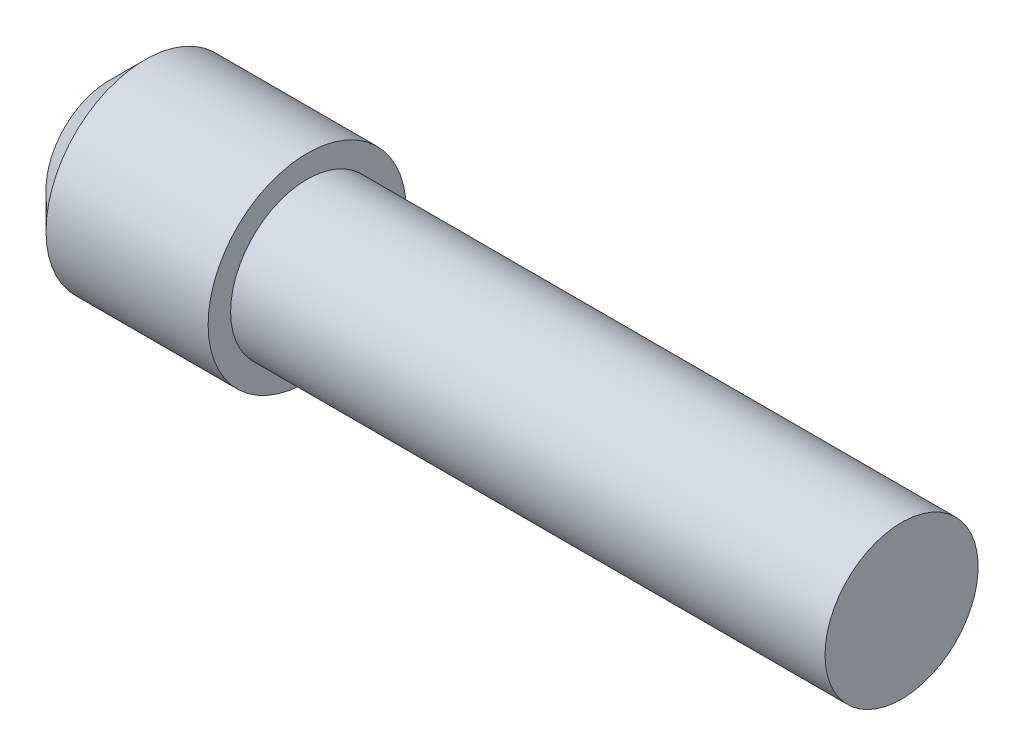
ISO-10303-21;
HEADER;
FILE_DESCRIPTION(('STEP AP214'),'2;1');
FILE_NAME('part.step','',(''),(''),'','','');
FILE_SCHEMA(('AUTOMOTIVE_DESIGN { 1 0 10303 214 1 1 1 1 }'));
ENDSEC;
DATA;
#1=APPLICATION_CONTEXT('core data for automotive mechanical design processes');
#2=APPLICATION_PROTOCOL_DEFINITION('international standard','automotive_design',2000,#1);
#3=PRODUCT_CONTEXT('',#1,'mechanical');
#4=PRODUCT('Part','Part','',(#3));
#5=PRODUCT_RELATED_PRODUCT_CATEGORY('part','',(#4));
#6=PRODUCT_DEFINITION_FORMATION('','',#4);
#7=PRODUCT_DEFINITION_CONTEXT('part definition',#1,'design');
#8=PRODUCT_DEFINITION('design','',#6,#7);
#9=PRODUCT_DEFINITION_SHAPE('','',#8);
#10=(LENGTH_UNIT() NAMED_UNIT(*) SI_UNIT(.MILLI.,.METRE.));
#11=(NAMED_UNIT(*) PLANE_ANGLE_UNIT() SI_UNIT($,.RADIAN.));
#12=(NAMED_UNIT(*) SI_UNIT($,.STERADIAN.) SOLID_ANGLE_UNIT());
#13=UNCERTAINTY_MEASURE_WITH_UNIT(LENGTH_MEASURE(1.E-05),#10,'distance_accuracy_value','');
#14=(GEOMETRIC_REPRESENTATION_CONTEXT(3) GLOBAL_UNCERTAINTY_ASSIGNED_CONTEXT((#13)) GLOBAL_UNIT_ASSIGNED_CONTEXT((#10,
#11,#12)) REPRESENTATION_CONTEXT('',''));
#15=CARTESIAN_POINT('',(0.,0.,0.));
#16=DIRECTION('',(0.,0.,1.));
#17=DIRECTION('',(1.,0.,0.));
#18=AXIS2_PLACEMENT_3D('',#15,#16,#17);
#19=CARTESIAN_POINT('',(0.,2.75,0.));
#20=DIRECTION('',(-1.,0.,0.));
#21=DIRECTION('',(0.,0.,1.));
#22=AXIS2_PLACEMENT_3D('',#19,#20,#21);
#23=PLANE('',#22);
#24=CARTESIAN_POINT('',(0.,0.,0.));
#25=DIRECTION('',(-1.,0.,0.));
#26=DIRECTION('',(0.,0.,1.));
#27=AXIS2_PLACEMENT_3D('',#24,#25,#26);
#28=CIRCLE('',#27,2.75);
#29=CARTESIAN_POINT('',(0.,0.,2.75));
#30=VERTEX_POINT('',#29);
#31=EDGE_CURVE('E48',#30,#30,#28,.T.);
#32=ORIENTED_EDGE('',*,*,#31,.F.);
#33=EDGE_LOOP('',(#32));
#34=FACE_BOUND('',#33,.T.);
#35=CARTESIAN_POINT('',(0.,0.,0.));
#36=DIRECTION('',(-1.,0.,0.));
#37=DIRECTION('',(0.,0.,1.));
#38=AXIS2_PLACEMENT_3D('',#35,#36,#37);
#39=CIRCLE('',#38,2.125);
#40=CARTESIAN_POINT('',(0.,0.,2.125));
#41=VERTEX_POINT('',#40);
#42=EDGE_CURVE('E57',#41,#41,#39,.T.);
#43=ORIENTED_EDGE('',*,*,#42,.T.);
#44=EDGE_LOOP('',(#43));
#45=FACE_BOUND('',#44,.T.);
#46=ADVANCED_FACE('F36',(#34,#45),#23,.F.);
#47=CARTESIAN_POINT('',(-9.45893719806763,0.,0.));
#48=DIRECTION('',(-1.,0.,0.));
#49=DIRECTION('',(0.,0.,1.));
#50=AXIS2_PLACEMENT_3D('',#47,#48,#49);
#51=CYLINDRICAL_SURFACE('',#50,2.75);
#52=CARTESIAN_POINT('',(-4.5,0.,0.));
#53=DIRECTION('',(1.,0.,0.));
#54=DIRECTION('',(0.,0.,-1.));
#55=AXIS2_PLACEMENT_3D('',#52,#53,#54);
#56=CIRCLE('',#55,2.75);
#57=CARTESIAN_POINT('',(-4.5,0.,-2.75));
#58=VERTEX_POINT('',#57);
#59=EDGE_CURVE('E10',#58,#58,#56,.T.);
#60=ORIENTED_EDGE('',*,*,#59,.T.);
#61=EDGE_LOOP('',(#60));
#62=FACE_BOUND('',#61,.T.);
#63=ORIENTED_EDGE('',*,*,#31,.T.);
#64=EDGE_LOOP('',(#63));
#65=FACE_BOUND('',#64,.T.);
#66=ADVANCED_FACE('F75',(#62,#65),#51,.T.);
#67=CARTESIAN_POINT('',(-5.5,2.75,0.));
#68=DIRECTION('',(1.,0.,0.));
#69=DIRECTION('',(0.,0.,-1.));
#70=AXIS2_PLACEMENT_3D('',#67,#68,#69);
#71=PLANE('',#70);
#72=CARTESIAN_POINT('',(-5.5,0.,0.));
#73=DIRECTION('',(1.,0.,0.));
#74=DIRECTION('',(0.,0.,-1.));
#75=AXIS2_PLACEMENT_3D('',#72,#73,#74);
#76=CIRCLE('',#75,1.75000000000001);
#77=CARTESIAN_POINT('',(-5.5,0.,-1.75000000000001));
#78=VERTEX_POINT('',#77);
#79=EDGE_CURVE('E44',#78,#78,#76,.F.);
#80=ORIENTED_EDGE('',*,*,#79,.T.);
#81=EDGE_LOOP('',(#80));
#82=FACE_BOUND('',#81,.T.);
#83=ADVANCED_FACE('F70',(#82),#71,.F.);
#84=CARTESIAN_POINT('',(16.5,2.125,0.));
#85=DIRECTION('',(-1.,0.,0.));
#86=DIRECTION('',(0.,0.,1.));
#87=AXIS2_PLACEMENT_3D('',#84,#85,#86);
#88=PLANE('',#87);
#89=CARTESIAN_POINT('',(16.5,0.,0.));
#90=DIRECTION('',(-1.,0.,0.));
#91=DIRECTION('',(0.,0.,1.));
#92=AXIS2_PLACEMENT_3D('',#89,#90,#91);
#93=CIRCLE('',#92,2.125);
#94=CARTESIAN_POINT('',(16.5,0.,2.125));
#95=VERTEX_POINT('',#94);
#96=EDGE_CURVE('E52',#95,#95,#93,.T.);
#97=ORIENTED_EDGE('',*,*,#96,.F.);
#98=EDGE_LOOP('',(#97));
#99=FACE_BOUND('',#98,.T.);
#100=ADVANCED_FACE('F65',(#99),#88,.F.);
#101=CARTESIAN_POINT('',(-9.45893719806763,0.,0.));
#102=DIRECTION('',(-1.,0.,0.));
#103=DIRECTION('',(0.,0.,1.));
#104=AXIS2_PLACEMENT_3D('',#101,#102,#103);
#105=CYLINDRICAL_SURFACE('',#104,2.125);
#106=ORIENTED_EDGE('',*,*,#42,.F.);
#107=EDGE_LOOP('',(#106));
#108=FACE_BOUND('',#107,.T.);
#109=ORIENTED_EDGE('',*,*,#96,.T.);
#110=EDGE_LOOP('',(#109));
#111=FACE_BOUND('',#110,.T.);
#112=ADVANCED_FACE('F62',(#108,#111),#105,.T.);
#113=CARTESIAN_POINT('',(-5.5,0.,0.));
#114=DIRECTION('',(1.,0.,0.));
#115=DIRECTION('',(0.,0.,-1.));
#116=AXIS2_PLACEMENT_3D('',#113,#114,#115);
#117=CONICAL_SURFACE('',#116,1.75000000000001,0.785398163397445);
#118=ORIENTED_EDGE('',*,*,#59,.F.);
#119=EDGE_LOOP('',(#118));
#120=FACE_BOUND('',#119,.T.);
#121=ORIENTED_EDGE('',*,*,#79,.F.);
#122=EDGE_LOOP('',(#121));
#123=FACE_BOUND('',#122,.T.);
#124=ADVANCED_FACE('F39',(#120,#123),#117,.T.);
#125=CLOSED_SHELL('',(#46,#66,#83,#100,#112,#124));
#126=MANIFOLD_SOLID_BREP('B2',#125);
#127=ADVANCED_BREP_SHAPE_REPRESENTATION('',(#18,#126),#14);
#128=SHAPE_DEFINITION_REPRESENTATION(#9,#127);
ENDSEC;
END-ISO-10303-21;
